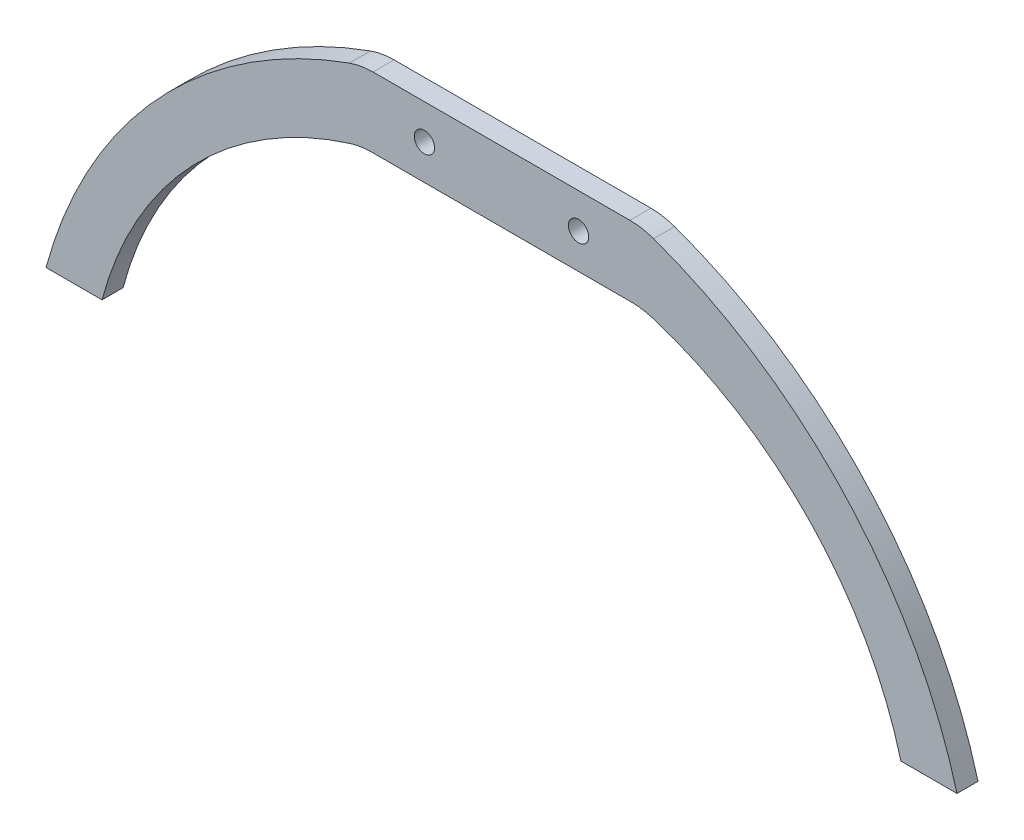
ISO-10303-21;
HEADER;
FILE_DESCRIPTION(('STEP AP214'),'2;1');
FILE_NAME('part.step','',(''),(''),'','','');
FILE_SCHEMA(('AUTOMOTIVE_DESIGN { 1 0 10303 214 1 1 1 1 }'));
ENDSEC;
DATA;
#1=APPLICATION_CONTEXT('core data for automotive mechanical design processes');
#2=APPLICATION_PROTOCOL_DEFINITION('international standard','automotive_design',2000,#1);
#3=PRODUCT_CONTEXT('',#1,'mechanical');
#4=PRODUCT('Part','Part','',(#3));
#5=PRODUCT_RELATED_PRODUCT_CATEGORY('part','',(#4));
#6=PRODUCT_DEFINITION_FORMATION('','',#4);
#7=PRODUCT_DEFINITION_CONTEXT('part definition',#1,'design');
#8=PRODUCT_DEFINITION('design','',#6,#7);
#9=PRODUCT_DEFINITION_SHAPE('','',#8);
#10=(LENGTH_UNIT() NAMED_UNIT(*) SI_UNIT(.MILLI.,.METRE.));
#11=(NAMED_UNIT(*) PLANE_ANGLE_UNIT() SI_UNIT($,.RADIAN.));
#12=(NAMED_UNIT(*) SI_UNIT($,.STERADIAN.) SOLID_ANGLE_UNIT());
#13=UNCERTAINTY_MEASURE_WITH_UNIT(LENGTH_MEASURE(1.E-05),#10,'distance_accuracy_value','');
#14=(GEOMETRIC_REPRESENTATION_CONTEXT(3) GLOBAL_UNCERTAINTY_ASSIGNED_CONTEXT((#13)) GLOBAL_UNIT_ASSIGNED_CONTEXT((#10,
#11,#12)) REPRESENTATION_CONTEXT('',''));
#15=CARTESIAN_POINT('',(0.,0.,0.));
#16=DIRECTION('',(0.,0.,1.));
#17=DIRECTION('',(1.,0.,0.));
#18=AXIS2_PLACEMENT_3D('',#15,#16,#17);
#19=CARTESIAN_POINT('',(21.6023724058561,-55.531194910811,3.));
#20=DIRECTION('',(0.,0.,-1.));
#21=DIRECTION('',(-1.,0.,0.));
#22=AXIS2_PLACEMENT_3D('',#19,#20,#21);
#23=CYLINDRICAL_SURFACE('',#22,69.);
#24=CARTESIAN_POINT('',(21.6023724058561,-55.531194910811,3.));
#25=DIRECTION('',(0.,0.,1.));
#26=DIRECTION('',(1.,0.,0.));
#27=AXIS2_PLACEMENT_3D('',#24,#25,#26);
#28=CIRCLE('',#27,69.);
#29=CARTESIAN_POINT('',(-1.7079845401811,9.41206693403578,3.));
#30=VERTEX_POINT('',#29);
#31=CARTESIAN_POINT('',(-45.,-37.5,3.));
#32=VERTEX_POINT('',#31);
#33=EDGE_CURVE('E135',#30,#32,#28,.T.);
#34=ORIENTED_EDGE('',*,*,#33,.F.);
#35=DIRECTION('',(0.,0.,-1.));
#36=VECTOR('',#35,1.);
#37=CARTESIAN_POINT('',(-1.7079845401811,9.41206693403578,3.));
#38=LINE('',#37,#36);
#39=CARTESIAN_POINT('',(-1.7079845401811,9.41206693403578,0.));
#40=VERTEX_POINT('',#39);
#41=EDGE_CURVE('E282',#30,#40,#38,.T.);
#42=ORIENTED_EDGE('',*,*,#41,.T.);
#43=CARTESIAN_POINT('',(21.6023724058561,-55.531194910811,0.));
#44=DIRECTION('',(0.,0.,1.));
#45=DIRECTION('',(1.,0.,0.));
#46=AXIS2_PLACEMENT_3D('',#43,#44,#45);
#47=CIRCLE('',#46,69.);
#48=CARTESIAN_POINT('',(-45.,-37.5,0.));
#49=VERTEX_POINT('',#48);
#50=EDGE_CURVE('E159',#40,#49,#47,.T.);
#51=ORIENTED_EDGE('',*,*,#50,.T.);
#52=DIRECTION('',(0.,0.,-1.));
#53=VECTOR('',#52,1.);
#54=CARTESIAN_POINT('',(-45.,-37.5,3.));
#55=LINE('',#54,#53);
#56=EDGE_CURVE('E151',#32,#49,#55,.T.);
#57=ORIENTED_EDGE('',*,*,#56,.F.);
#58=EDGE_LOOP('',(#34,#42,#51,#57));
#59=FACE_BOUND('',#58,.T.);
#60=ADVANCED_FACE('F46',(#59),#23,.T.);
#61=CARTESIAN_POINT('',(-45.,-37.5,3.));
#62=DIRECTION('',(0.,1.,0.));
#63=DIRECTION('',(-1.,0.,0.));
#64=AXIS2_PLACEMENT_3D('',#61,#62,#63);
#65=PLANE('',#64);
#66=DIRECTION('',(1.,0.,0.));
#67=VECTOR('',#66,1.);
#68=CARTESIAN_POINT('',(-45.,-37.5,0.));
#69=LINE('',#68,#67);
#70=CARTESIAN_POINT('',(-37.,-37.5,0.));
#71=VERTEX_POINT('',#70);
#72=EDGE_CURVE('E242',#49,#71,#69,.T.);
#73=ORIENTED_EDGE('',*,*,#72,.T.);
#74=DIRECTION('',(0.,0.,-1.));
#75=VECTOR('',#74,1.);
#76=CARTESIAN_POINT('',(-37.,-37.5,3.));
#77=LINE('',#76,#75);
#78=CARTESIAN_POINT('',(-37.,-37.5,3.));
#79=VERTEX_POINT('',#78);
#80=EDGE_CURVE('E153',#79,#71,#77,.T.);
#81=ORIENTED_EDGE('',*,*,#80,.F.);
#82=DIRECTION('',(1.,0.,0.));
#83=VECTOR('',#82,1.);
#84=CARTESIAN_POINT('',(-45.,-37.5,3.));
#85=LINE('',#84,#83);
#86=EDGE_CURVE('E139',#32,#79,#85,.T.);
#87=ORIENTED_EDGE('',*,*,#86,.F.);
#88=ORIENTED_EDGE('',*,*,#56,.T.);
#89=EDGE_LOOP('',(#73,#81,#87,#88));
#90=FACE_BOUND('',#89,.T.);
#91=ADVANCED_FACE('F150',(#90),#65,.F.);
#92=CARTESIAN_POINT('',(14.2381887077596,-51.0516795249895,3.));
#93=DIRECTION('',(0.,0.,-1.));
#94=DIRECTION('',(-1.,0.,0.));
#95=AXIS2_PLACEMENT_3D('',#92,#93,#94);
#96=CYLINDRICAL_SURFACE('',#95,53.);
#97=CARTESIAN_POINT('',(14.2381887077596,-51.0516795249895,0.));
#98=DIRECTION('',(0.,0.,-1.));
#99=DIRECTION('',(-1.,0.,0.));
#100=AXIS2_PLACEMENT_3D('',#97,#98,#99);
#101=CIRCLE('',#100,53.);
#102=CARTESIAN_POINT('',(-1.53468439418626,-0.453097784886176,0.));
#103=VERTEX_POINT('',#102);
#104=EDGE_CURVE('E243',#71,#103,#101,.T.);
#105=ORIENTED_EDGE('',*,*,#104,.T.);
#106=DIRECTION('',(0.,0.,-1.));
#107=VECTOR('',#106,1.);
#108=CARTESIAN_POINT('',(-1.53468439418626,-0.453097784886163,3.));
#109=LINE('',#108,#107);
#110=CARTESIAN_POINT('',(-1.53468439418626,-0.453097784886176,3.));
#111=VERTEX_POINT('',#110);
#112=EDGE_CURVE('E174',#103,#111,#109,.F.);
#113=ORIENTED_EDGE('',*,*,#112,.T.);
#114=CARTESIAN_POINT('',(14.2381887077596,-51.0516795249895,3.));
#115=DIRECTION('',(0.,0.,-1.));
#116=DIRECTION('',(-1.,0.,0.));
#117=AXIS2_PLACEMENT_3D('',#114,#115,#116);
#118=CIRCLE('',#117,53.);
#119=EDGE_CURVE('E156',#79,#111,#118,.T.);
#120=ORIENTED_EDGE('',*,*,#119,.F.);
#121=ORIENTED_EDGE('',*,*,#80,.T.);
#122=EDGE_LOOP('',(#105,#113,#120,#121));
#123=FACE_BOUND('',#122,.T.);
#124=ADVANCED_FACE('F295',(#123),#96,.F.);
#125=CARTESIAN_POINT('',(0.,0.,3.));
#126=DIRECTION('',(0.,1.,0.));
#127=DIRECTION('',(0.,0.,1.));
#128=AXIS2_PLACEMENT_3D('',#125,#126,#127);
#129=PLANE('',#128);
#130=DIRECTION('',(1.,0.,0.));
#131=VECTOR('',#130,1.);
#132=CARTESIAN_POINT('',(0.,0.,0.));
#133=LINE('',#132,#131);
#134=CARTESIAN_POINT('',(1.44132939863371,0.,0.));
#135=VERTEX_POINT('',#134);
#136=CARTESIAN_POINT('',(38.5586706013663,0.,0.));
#137=VERTEX_POINT('',#136);
#138=EDGE_CURVE('E248',#135,#137,#133,.T.);
#139=ORIENTED_EDGE('',*,*,#138,.T.);
#140=DIRECTION('',(0.,0.,1.));
#141=VECTOR('',#140,1.);
#142=CARTESIAN_POINT('',(38.5586706013663,0.,3.));
#143=LINE('',#142,#141);
#144=CARTESIAN_POINT('',(38.5586706013663,0.,3.));
#145=VERTEX_POINT('',#144);
#146=EDGE_CURVE('E172',#137,#145,#143,.T.);
#147=ORIENTED_EDGE('',*,*,#146,.T.);
#148=DIRECTION('',(1.,0.,0.));
#149=VECTOR('',#148,1.);
#150=CARTESIAN_POINT('',(0.,0.,3.));
#151=LINE('',#150,#149);
#152=CARTESIAN_POINT('',(1.44132939863371,0.,3.));
#153=VERTEX_POINT('',#152);
#154=EDGE_CURVE('E208',#153,#145,#151,.T.);
#155=ORIENTED_EDGE('',*,*,#154,.F.);
#156=DIRECTION('',(0.,0.,1.));
#157=VECTOR('',#156,1.);
#158=CARTESIAN_POINT('',(1.44132939863371,0.,0.));
#159=LINE('',#158,#157);
#160=EDGE_CURVE('E164',#153,#135,#159,.F.);
#161=ORIENTED_EDGE('',*,*,#160,.T.);
#162=EDGE_LOOP('',(#139,#147,#155,#161));
#163=FACE_BOUND('',#162,.T.);
#164=ADVANCED_FACE('F302',(#163),#129,.F.);
#165=CARTESIAN_POINT('',(25.7618112922404,-51.0516795249895,3.));
#166=DIRECTION('',(0.,0.,-1.));
#167=DIRECTION('',(-1.,0.,0.));
#168=AXIS2_PLACEMENT_3D('',#165,#166,#167);
#169=CYLINDRICAL_SURFACE('',#168,53.);
#170=CARTESIAN_POINT('',(25.7618112922404,-51.0516795249895,3.));
#171=DIRECTION('',(0.,0.,-1.));
#172=DIRECTION('',(-1.,0.,0.));
#173=AXIS2_PLACEMENT_3D('',#170,#171,#172);
#174=CIRCLE('',#173,53.);
#175=CARTESIAN_POINT('',(41.5346843941862,-0.453097784886169,3.));
#176=VERTEX_POINT('',#175);
#177=CARTESIAN_POINT('',(77.,-37.5,3.));
#178=VERTEX_POINT('',#177);
#179=EDGE_CURVE('E212',#176,#178,#174,.T.);
#180=ORIENTED_EDGE('',*,*,#179,.F.);
#181=DIRECTION('',(0.,0.,-1.));
#182=VECTOR('',#181,1.);
#183=CARTESIAN_POINT('',(41.5346843941862,-0.453097784886163,3.));
#184=LINE('',#183,#182);
#185=CARTESIAN_POINT('',(41.5346843941862,-0.453097784886169,0.));
#186=VERTEX_POINT('',#185);
#187=EDGE_CURVE('E161',#176,#186,#184,.T.);
#188=ORIENTED_EDGE('',*,*,#187,.T.);
#189=CARTESIAN_POINT('',(25.7618112922404,-51.0516795249895,0.));
#190=DIRECTION('',(0.,0.,-1.));
#191=DIRECTION('',(-1.,0.,0.));
#192=AXIS2_PLACEMENT_3D('',#189,#190,#191);
#193=CIRCLE('',#192,53.);
#194=CARTESIAN_POINT('',(77.,-37.5,0.));
#195=VERTEX_POINT('',#194);
#196=EDGE_CURVE('E251',#186,#195,#193,.T.);
#197=ORIENTED_EDGE('',*,*,#196,.T.);
#198=DIRECTION('',(0.,0.,-1.));
#199=VECTOR('',#198,1.);
#200=CARTESIAN_POINT('',(77.,-37.5,3.));
#201=LINE('',#200,#199);
#202=EDGE_CURVE('E166',#178,#195,#201,.T.);
#203=ORIENTED_EDGE('',*,*,#202,.F.);
#204=EDGE_LOOP('',(#180,#188,#197,#203));
#205=FACE_BOUND('',#204,.T.);
#206=ADVANCED_FACE('F409',(#205),#169,.F.);
#207=CARTESIAN_POINT('',(77.,-37.5,3.));
#208=DIRECTION('',(0.,1.,0.));
#209=DIRECTION('',(-1.,0.,0.));
#210=AXIS2_PLACEMENT_3D('',#207,#208,#209);
#211=PLANE('',#210);
#212=DIRECTION('',(1.,0.,0.));
#213=VECTOR('',#212,1.);
#214=CARTESIAN_POINT('',(77.,-37.5,0.));
#215=LINE('',#214,#213);
#216=CARTESIAN_POINT('',(85.,-37.5,0.));
#217=VERTEX_POINT('',#216);
#218=EDGE_CURVE('E253',#195,#217,#215,.T.);
#219=ORIENTED_EDGE('',*,*,#218,.T.);
#220=DIRECTION('',(0.,0.,-1.));
#221=VECTOR('',#220,1.);
#222=CARTESIAN_POINT('',(85.,-37.5,3.));
#223=LINE('',#222,#221);
#224=CARTESIAN_POINT('',(85.,-37.5,3.));
#225=VERTEX_POINT('',#224);
#226=EDGE_CURVE('E259',#225,#217,#223,.T.);
#227=ORIENTED_EDGE('',*,*,#226,.F.);
#228=DIRECTION('',(1.,0.,0.));
#229=VECTOR('',#228,1.);
#230=CARTESIAN_POINT('',(77.,-37.5,3.));
#231=LINE('',#230,#229);
#232=EDGE_CURVE('E215',#178,#225,#231,.T.);
#233=ORIENTED_EDGE('',*,*,#232,.F.);
#234=ORIENTED_EDGE('',*,*,#202,.T.);
#235=EDGE_LOOP('',(#219,#227,#233,#234));
#236=FACE_BOUND('',#235,.T.);
#237=ADVANCED_FACE('F266',(#236),#211,.F.);
#238=CARTESIAN_POINT('',(18.3976275941439,-55.531194910811,3.));
#239=DIRECTION('',(0.,0.,-1.));
#240=DIRECTION('',(-1.,0.,0.));
#241=AXIS2_PLACEMENT_3D('',#238,#239,#240);
#242=CYLINDRICAL_SURFACE('',#241,69.);
#243=CARTESIAN_POINT('',(18.3976275941439,-55.531194910811,0.));
#244=DIRECTION('',(0.,0.,1.));
#245=DIRECTION('',(-1.,0.,0.));
#246=AXIS2_PLACEMENT_3D('',#243,#244,#245);
#247=CIRCLE('',#246,69.);
#248=CARTESIAN_POINT('',(41.7079845401811,9.41206693403578,0.));
#249=VERTEX_POINT('',#248);
#250=EDGE_CURVE('E255',#217,#249,#247,.T.);
#251=ORIENTED_EDGE('',*,*,#250,.T.);
#252=DIRECTION('',(0.,0.,-1.));
#253=VECTOR('',#252,1.);
#254=CARTESIAN_POINT('',(41.7079845401811,9.41206693403578,3.));
#255=LINE('',#254,#253);
#256=CARTESIAN_POINT('',(41.7079845401811,9.41206693403578,3.));
#257=VERTEX_POINT('',#256);
#258=EDGE_CURVE('E70',#249,#257,#255,.F.);
#259=ORIENTED_EDGE('',*,*,#258,.T.);
#260=CARTESIAN_POINT('',(18.3976275941439,-55.531194910811,3.));
#261=DIRECTION('',(0.,0.,1.));
#262=DIRECTION('',(-1.,0.,0.));
#263=AXIS2_PLACEMENT_3D('',#260,#261,#262);
#264=CIRCLE('',#263,69.);
#265=EDGE_CURVE('E219',#225,#257,#264,.T.);
#266=ORIENTED_EDGE('',*,*,#265,.F.);
#267=ORIENTED_EDGE('',*,*,#226,.T.);
#268=EDGE_LOOP('',(#251,#259,#266,#267));
#269=FACE_BOUND('',#268,.T.);
#270=ADVANCED_FACE('F275',(#269),#242,.T.);
#271=CARTESIAN_POINT('',(0.,10.,3.));
#272=DIRECTION('',(0.,-1.,0.));
#273=DIRECTION('',(1.,0.,0.));
#274=AXIS2_PLACEMENT_3D('',#271,#272,#273);
#275=PLANE('',#274);
#276=DIRECTION('',(-1.,0.,0.));
#277=VECTOR('',#276,1.);
#278=CARTESIAN_POINT('',(0.,10.,3.));
#279=LINE('',#278,#277);
#280=CARTESIAN_POINT('',(38.3296719393062,10.,3.));
#281=VERTEX_POINT('',#280);
#282=CARTESIAN_POINT('',(1.67032806069385,10.,3.));
#283=VERTEX_POINT('',#282);
#284=EDGE_CURVE('E222',#281,#283,#279,.T.);
#285=ORIENTED_EDGE('',*,*,#284,.F.);
#286=DIRECTION('',(0.,0.,-1.));
#287=VECTOR('',#286,1.);
#288=CARTESIAN_POINT('',(38.3296719393062,10.,3.));
#289=LINE('',#288,#287);
#290=CARTESIAN_POINT('',(38.3296719393062,10.,0.));
#291=VERTEX_POINT('',#290);
#292=EDGE_CURVE('E178',#281,#291,#289,.T.);
#293=ORIENTED_EDGE('',*,*,#292,.T.);
#294=DIRECTION('',(-1.,0.,0.));
#295=VECTOR('',#294,1.);
#296=CARTESIAN_POINT('',(0.,10.,0.));
#297=LINE('',#296,#295);
#298=CARTESIAN_POINT('',(1.67032806069385,10.,0.));
#299=VERTEX_POINT('',#298);
#300=EDGE_CURVE('E146',#291,#299,#297,.T.);
#301=ORIENTED_EDGE('',*,*,#300,.T.);
#302=DIRECTION('',(0.,0.,-1.));
#303=VECTOR('',#302,1.);
#304=CARTESIAN_POINT('',(1.67032806069385,10.,3.));
#305=LINE('',#304,#303);
#306=EDGE_CURVE('E176',#299,#283,#305,.F.);
#307=ORIENTED_EDGE('',*,*,#306,.T.);
#308=EDGE_LOOP('',(#285,#293,#301,#307));
#309=FACE_BOUND('',#308,.T.);
#310=ADVANCED_FACE('F308',(#309),#275,.F.);
#311=CARTESIAN_POINT('',(21.6023724058561,-55.531194910811,3.));
#312=DIRECTION('',(0.,0.,1.));
#313=DIRECTION('',(1.,0.,0.));
#314=AXIS2_PLACEMENT_3D('',#311,#312,#313);
#315=PLANE('',#314);
#316=CARTESIAN_POINT('',(9.,5.,3.));
#317=DIRECTION('',(0.,0.,1.));
#318=DIRECTION('',(1.,0.,0.));
#319=AXIS2_PLACEMENT_3D('',#316,#317,#318);
#320=CIRCLE('',#319,1.45);
#321=CARTESIAN_POINT('',(10.45,5.,3.));
#322=VERTEX_POINT('',#321);
#323=EDGE_CURVE('E233',#322,#322,#320,.T.);
#324=ORIENTED_EDGE('',*,*,#323,.F.);
#325=EDGE_LOOP('',(#324));
#326=FACE_BOUND('',#325,.T.);
#327=CARTESIAN_POINT('',(31.,5.,3.));
#328=DIRECTION('',(0.,0.,1.));
#329=DIRECTION('',(1.,0.,0.));
#330=AXIS2_PLACEMENT_3D('',#327,#328,#329);
#331=CIRCLE('',#330,1.45);
#332=CARTESIAN_POINT('',(32.45,5.,3.));
#333=VERTEX_POINT('',#332);
#334=EDGE_CURVE('E229',#333,#333,#331,.T.);
#335=ORIENTED_EDGE('',*,*,#334,.F.);
#336=EDGE_LOOP('',(#335));
#337=FACE_BOUND('',#336,.T.);
#338=ORIENTED_EDGE('',*,*,#265,.T.);
#339=CARTESIAN_POINT('',(38.3296719393062,0.,3.));
#340=DIRECTION('',(0.,0.,1.));
#341=DIRECTION('',(1.,0.,0.));
#342=AXIS2_PLACEMENT_3D('',#339,#340,#341);
#343=CIRCLE('',#342,10.);
#344=EDGE_CURVE('E189',#257,#281,#343,.T.);
#345=ORIENTED_EDGE('',*,*,#344,.T.);
#346=ORIENTED_EDGE('',*,*,#284,.T.);
#347=CARTESIAN_POINT('',(1.67032806069385,0.,3.));
#348=DIRECTION('',(0.,0.,1.));
#349=DIRECTION('',(1.,0.,0.));
#350=AXIS2_PLACEMENT_3D('',#347,#348,#349);
#351=CIRCLE('',#350,10.);
#352=EDGE_CURVE('E62',#283,#30,#351,.T.);
#353=ORIENTED_EDGE('',*,*,#352,.T.);
#354=ORIENTED_EDGE('',*,*,#33,.T.);
#355=ORIENTED_EDGE('',*,*,#86,.T.);
#356=ORIENTED_EDGE('',*,*,#119,.T.);
#357=CARTESIAN_POINT('',(1.44132939863371,-10.,3.));
#358=DIRECTION('',(0.,0.,1.));
#359=DIRECTION('',(1.,0.,0.));
#360=AXIS2_PLACEMENT_3D('',#357,#358,#359);
#361=CIRCLE('',#360,10.);
#362=EDGE_CURVE('E12',#111,#153,#361,.F.);
#363=ORIENTED_EDGE('',*,*,#362,.T.);
#364=ORIENTED_EDGE('',*,*,#154,.T.);
#365=CARTESIAN_POINT('',(38.5586706013663,-10.,3.));
#366=DIRECTION('',(0.,0.,1.));
#367=DIRECTION('',(1.,0.,0.));
#368=AXIS2_PLACEMENT_3D('',#365,#366,#367);
#369=CIRCLE('',#368,10.);
#370=EDGE_CURVE('E285',#145,#176,#369,.F.);
#371=ORIENTED_EDGE('',*,*,#370,.T.);
#372=ORIENTED_EDGE('',*,*,#179,.T.);
#373=ORIENTED_EDGE('',*,*,#232,.T.);
#374=EDGE_LOOP('',(#338,#345,#346,#353,#354,#355,#356,#363,#364,#371,#372,#373));
#375=FACE_BOUND('',#374,.T.);
#376=ADVANCED_FACE('F137',(#326,#337,#375),#315,.T.);
#377=CARTESIAN_POINT('',(21.6023724058561,-55.531194910811,0.));
#378=DIRECTION('',(0.,0.,1.));
#379=DIRECTION('',(1.,0.,0.));
#380=AXIS2_PLACEMENT_3D('',#377,#378,#379);
#381=PLANE('',#380);
#382=CARTESIAN_POINT('',(9.,5.,0.));
#383=DIRECTION('',(0.,0.,1.));
#384=DIRECTION('',(1.,0.,0.));
#385=AXIS2_PLACEMENT_3D('',#382,#383,#384);
#386=CIRCLE('',#385,1.45);
#387=CARTESIAN_POINT('',(10.45,5.,0.));
#388=VERTEX_POINT('',#387);
#389=EDGE_CURVE('E238',#388,#388,#386,.T.);
#390=ORIENTED_EDGE('',*,*,#389,.T.);
#391=EDGE_LOOP('',(#390));
#392=FACE_BOUND('',#391,.T.);
#393=CARTESIAN_POINT('',(31.,5.,0.));
#394=DIRECTION('',(0.,0.,1.));
#395=DIRECTION('',(1.,0.,0.));
#396=AXIS2_PLACEMENT_3D('',#393,#394,#395);
#397=CIRCLE('',#396,1.45);
#398=CARTESIAN_POINT('',(32.45,5.,0.));
#399=VERTEX_POINT('',#398);
#400=EDGE_CURVE('E201',#399,#399,#397,.T.);
#401=ORIENTED_EDGE('',*,*,#400,.T.);
#402=EDGE_LOOP('',(#401));
#403=FACE_BOUND('',#402,.T.);
#404=ORIENTED_EDGE('',*,*,#300,.F.);
#405=CARTESIAN_POINT('',(38.3296719393062,0.,0.));
#406=DIRECTION('',(0.,0.,1.));
#407=DIRECTION('',(1.,0.,0.));
#408=AXIS2_PLACEMENT_3D('',#405,#406,#407);
#409=CIRCLE('',#408,10.);
#410=EDGE_CURVE('E183',#291,#249,#409,.F.);
#411=ORIENTED_EDGE('',*,*,#410,.T.);
#412=ORIENTED_EDGE('',*,*,#250,.F.);
#413=ORIENTED_EDGE('',*,*,#218,.F.);
#414=ORIENTED_EDGE('',*,*,#196,.F.);
#415=CARTESIAN_POINT('',(38.5586706013663,-10.,0.));
#416=DIRECTION('',(0.,0.,1.));
#417=DIRECTION('',(1.,0.,0.));
#418=AXIS2_PLACEMENT_3D('',#415,#416,#417);
#419=CIRCLE('',#418,10.);
#420=EDGE_CURVE('E284',#186,#137,#419,.T.);
#421=ORIENTED_EDGE('',*,*,#420,.T.);
#422=ORIENTED_EDGE('',*,*,#138,.F.);
#423=CARTESIAN_POINT('',(1.44132939863371,-10.,0.));
#424=DIRECTION('',(0.,0.,1.));
#425=DIRECTION('',(1.,0.,0.));
#426=AXIS2_PLACEMENT_3D('',#423,#424,#425);
#427=CIRCLE('',#426,10.);
#428=EDGE_CURVE('E55',#135,#103,#427,.T.);
#429=ORIENTED_EDGE('',*,*,#428,.T.);
#430=ORIENTED_EDGE('',*,*,#104,.F.);
#431=ORIENTED_EDGE('',*,*,#72,.F.);
#432=ORIENTED_EDGE('',*,*,#50,.F.);
#433=CARTESIAN_POINT('',(1.67032806069385,0.,0.));
#434=DIRECTION('',(0.,0.,1.));
#435=DIRECTION('',(1.,0.,0.));
#436=AXIS2_PLACEMENT_3D('',#433,#434,#435);
#437=CIRCLE('',#436,10.);
#438=EDGE_CURVE('E181',#40,#299,#437,.F.);
#439=ORIENTED_EDGE('',*,*,#438,.T.);
#440=EDGE_LOOP('',(#404,#411,#412,#413,#414,#421,#422,#429,#430,#431,#432,#439));
#441=FACE_BOUND('',#440,.T.);
#442=ADVANCED_FACE('F274',(#392,#403,#441),#381,.F.);
#443=CARTESIAN_POINT('',(31.,5.,0.));
#444=DIRECTION('',(0.,0.,1.));
#445=DIRECTION('',(1.,0.,0.));
#446=AXIS2_PLACEMENT_3D('',#443,#444,#445);
#447=CYLINDRICAL_SURFACE('',#446,1.45);
#448=ORIENTED_EDGE('',*,*,#400,.F.);
#449=EDGE_LOOP('',(#448));
#450=FACE_BOUND('',#449,.T.);
#451=ORIENTED_EDGE('',*,*,#334,.T.);
#452=EDGE_LOOP('',(#451));
#453=FACE_BOUND('',#452,.T.);
#454=ADVANCED_FACE('F367',(#450,#453),#447,.F.);
#455=CARTESIAN_POINT('',(9.,5.,0.));
#456=DIRECTION('',(0.,0.,1.));
#457=DIRECTION('',(1.,0.,0.));
#458=AXIS2_PLACEMENT_3D('',#455,#456,#457);
#459=CYLINDRICAL_SURFACE('',#458,1.45);
#460=ORIENTED_EDGE('',*,*,#389,.F.);
#461=EDGE_LOOP('',(#460));
#462=FACE_BOUND('',#461,.T.);
#463=ORIENTED_EDGE('',*,*,#323,.T.);
#464=EDGE_LOOP('',(#463));
#465=FACE_BOUND('',#464,.T.);
#466=ADVANCED_FACE('F332',(#462,#465),#459,.F.);
#467=CARTESIAN_POINT('',(38.5586706013663,-10.,3.));
#468=DIRECTION('',(0.,0.,-1.));
#469=DIRECTION('',(-1.,0.,0.));
#470=AXIS2_PLACEMENT_3D('',#467,#468,#469);
#471=CYLINDRICAL_SURFACE('',#470,10.);
#472=ORIENTED_EDGE('',*,*,#370,.F.);
#473=ORIENTED_EDGE('',*,*,#146,.F.);
#474=ORIENTED_EDGE('',*,*,#420,.F.);
#475=ORIENTED_EDGE('',*,*,#187,.F.);
#476=EDGE_LOOP('',(#472,#473,#474,#475));
#477=FACE_BOUND('',#476,.T.);
#478=ADVANCED_FACE('F329',(#477),#471,.F.);
#479=CARTESIAN_POINT('',(1.44132939863371,-10.,3.));
#480=DIRECTION('',(0.,0.,-1.));
#481=DIRECTION('',(-1.,0.,0.));
#482=AXIS2_PLACEMENT_3D('',#479,#480,#481);
#483=CYLINDRICAL_SURFACE('',#482,10.);
#484=ORIENTED_EDGE('',*,*,#362,.F.);
#485=ORIENTED_EDGE('',*,*,#112,.F.);
#486=ORIENTED_EDGE('',*,*,#428,.F.);
#487=ORIENTED_EDGE('',*,*,#160,.F.);
#488=EDGE_LOOP('',(#484,#485,#486,#487));
#489=FACE_BOUND('',#488,.T.);
#490=ADVANCED_FACE('F297',(#489),#483,.F.);
#491=CARTESIAN_POINT('',(38.3296719393062,0.,3.));
#492=DIRECTION('',(0.,0.,-1.));
#493=DIRECTION('',(-1.,0.,0.));
#494=AXIS2_PLACEMENT_3D('',#491,#492,#493);
#495=CYLINDRICAL_SURFACE('',#494,10.);
#496=ORIENTED_EDGE('',*,*,#344,.F.);
#497=ORIENTED_EDGE('',*,*,#258,.F.);
#498=ORIENTED_EDGE('',*,*,#410,.F.);
#499=ORIENTED_EDGE('',*,*,#292,.F.);
#500=EDGE_LOOP('',(#496,#497,#498,#499));
#501=FACE_BOUND('',#500,.T.);
#502=ADVANCED_FACE('F278',(#501),#495,.T.);
#503=CARTESIAN_POINT('',(1.67032806069385,0.,3.));
#504=DIRECTION('',(0.,0.,-1.));
#505=DIRECTION('',(-1.,0.,0.));
#506=AXIS2_PLACEMENT_3D('',#503,#504,#505);
#507=CYLINDRICAL_SURFACE('',#506,10.);
#508=ORIENTED_EDGE('',*,*,#352,.F.);
#509=ORIENTED_EDGE('',*,*,#306,.F.);
#510=ORIENTED_EDGE('',*,*,#438,.F.);
#511=ORIENTED_EDGE('',*,*,#41,.F.);
#512=EDGE_LOOP('',(#508,#509,#510,#511));
#513=FACE_BOUND('',#512,.T.);
#514=ADVANCED_FACE('F48',(#513),#507,.T.);
#515=CLOSED_SHELL('',(#60,#91,#124,#164,#206,#237,#270,#310,#376,#442,#454,#466,#478,#490,#502,#514));
#516=MANIFOLD_SOLID_BREP('B2',#515);
#517=ADVANCED_BREP_SHAPE_REPRESENTATION('',(#18,#516),#14);
#518=SHAPE_DEFINITION_REPRESENTATION(#9,#517);
ENDSEC;
END-ISO-10303-21;
